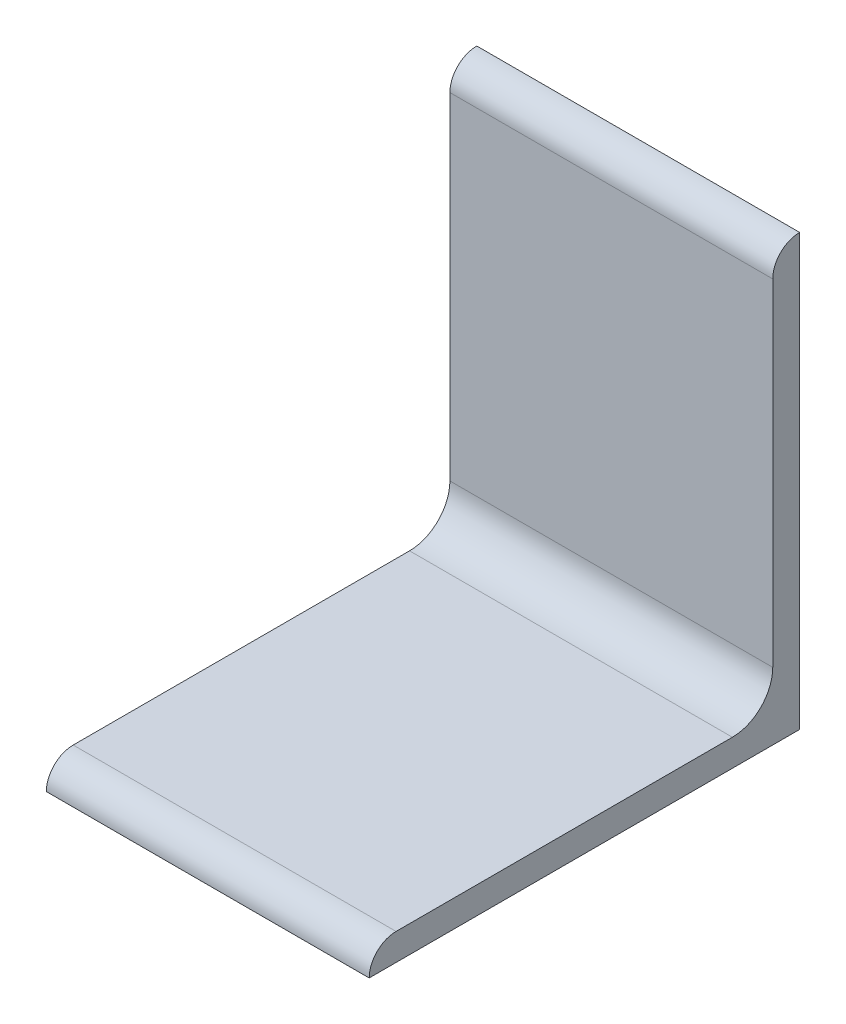
ISO-10303-21;
HEADER;
FILE_DESCRIPTION(('STEP AP214'),'2;1');
FILE_NAME('part.step','',(''),(''),'','','');
FILE_SCHEMA(('AUTOMOTIVE_DESIGN { 1 0 10303 214 1 1 1 1 }'));
ENDSEC;
DATA;
#1=APPLICATION_CONTEXT('core data for automotive mechanical design processes');
#2=APPLICATION_PROTOCOL_DEFINITION('international standard','automotive_design',2000,#1);
#3=PRODUCT_CONTEXT('',#1,'mechanical');
#4=PRODUCT('Part','Part','',(#3));
#5=PRODUCT_RELATED_PRODUCT_CATEGORY('part','',(#4));
#6=PRODUCT_DEFINITION_FORMATION('','',#4);
#7=PRODUCT_DEFINITION_CONTEXT('part definition',#1,'design');
#8=PRODUCT_DEFINITION('design','',#6,#7);
#9=PRODUCT_DEFINITION_SHAPE('','',#8);
#10=(LENGTH_UNIT() NAMED_UNIT(*) SI_UNIT(.MILLI.,.METRE.));
#11=(NAMED_UNIT(*) PLANE_ANGLE_UNIT() SI_UNIT($,.RADIAN.));
#12=(NAMED_UNIT(*) SI_UNIT($,.STERADIAN.) SOLID_ANGLE_UNIT());
#13=UNCERTAINTY_MEASURE_WITH_UNIT(LENGTH_MEASURE(1.E-05),#10,'distance_accuracy_value','');
#14=(GEOMETRIC_REPRESENTATION_CONTEXT(3) GLOBAL_UNCERTAINTY_ASSIGNED_CONTEXT((#13)) GLOBAL_UNIT_ASSIGNED_CONTEXT((#10,
#11,#12)) REPRESENTATION_CONTEXT('',''));
#15=CARTESIAN_POINT('',(0.,0.,0.));
#16=DIRECTION('',(0.,0.,1.));
#17=DIRECTION('',(1.,0.,0.));
#18=AXIS2_PLACEMENT_3D('',#15,#16,#17);
#19=CARTESIAN_POINT('',(38.1,50.8,0.));
#20=DIRECTION('',(0.,0.,1.));
#21=DIRECTION('',(1.,0.,0.));
#22=AXIS2_PLACEMENT_3D('',#19,#20,#21);
#23=PLANE('',#22);
#24=DIRECTION('',(0.,1.,0.));
#25=VECTOR('',#24,1.);
#26=CARTESIAN_POINT('',(0.,50.8,0.));
#27=LINE('',#26,#25);
#28=CARTESIAN_POINT('',(0.,0.,0.));
#29=VERTEX_POINT('',#28);
#30=CARTESIAN_POINT('',(0.,50.8,0.));
#31=VERTEX_POINT('',#30);
#32=EDGE_CURVE('E168',#29,#31,#27,.T.);
#33=ORIENTED_EDGE('',*,*,#32,.T.);
#34=DIRECTION('',(-1.,0.,0.));
#35=VECTOR('',#34,1.);
#36=CARTESIAN_POINT('',(38.1,50.8,0.));
#37=LINE('',#36,#35);
#38=CARTESIAN_POINT('',(38.1,50.8,0.));
#39=VERTEX_POINT('',#38);
#40=EDGE_CURVE('E13',#39,#31,#37,.T.);
#41=ORIENTED_EDGE('',*,*,#40,.F.);
#42=DIRECTION('',(0.,1.,0.));
#43=VECTOR('',#42,1.);
#44=CARTESIAN_POINT('',(38.1,50.8,0.));
#45=LINE('',#44,#43);
#46=CARTESIAN_POINT('',(38.1,0.,0.));
#47=VERTEX_POINT('',#46);
#48=EDGE_CURVE('E184',#47,#39,#45,.T.);
#49=ORIENTED_EDGE('',*,*,#48,.F.);
#50=DIRECTION('',(-1.,0.,0.));
#51=VECTOR('',#50,1.);
#52=CARTESIAN_POINT('',(38.1,0.,0.));
#53=LINE('',#52,#51);
#54=EDGE_CURVE('E164',#47,#29,#53,.T.);
#55=ORIENTED_EDGE('',*,*,#54,.T.);
#56=EDGE_LOOP('',(#33,#41,#49,#55));
#57=FACE_BOUND('',#56,.T.);
#58=ADVANCED_FACE('F66',(#57),#23,.F.);
#59=CARTESIAN_POINT('',(38.1,50.8,0.00508));
#60=DIRECTION('',(0.,-1.,0.));
#61=DIRECTION('',(0.,0.,-1.));
#62=AXIS2_PLACEMENT_3D('',#59,#60,#61);
#63=PLANE('',#62);
#64=DIRECTION('',(0.,0.,1.));
#65=VECTOR('',#64,1.);
#66=CARTESIAN_POINT('',(0.,50.8,0.00508));
#67=LINE('',#66,#65);
#68=CARTESIAN_POINT('',(0.,50.8,0.00508000000000012));
#69=VERTEX_POINT('',#68);
#70=EDGE_CURVE('E171',#31,#69,#67,.T.);
#71=ORIENTED_EDGE('',*,*,#70,.T.);
#72=DIRECTION('',(-1.,0.,0.));
#73=VECTOR('',#72,1.);
#74=CARTESIAN_POINT('',(38.1,50.8,0.00508000000000012));
#75=LINE('',#74,#73);
#76=CARTESIAN_POINT('',(38.1,50.8,0.00508000000000012));
#77=VERTEX_POINT('',#76);
#78=EDGE_CURVE('E74',#77,#69,#75,.T.);
#79=ORIENTED_EDGE('',*,*,#78,.F.);
#80=DIRECTION('',(0.,0.,1.));
#81=VECTOR('',#80,1.);
#82=CARTESIAN_POINT('',(38.1,50.8,0.00508));
#83=LINE('',#82,#81);
#84=EDGE_CURVE('E128',#39,#77,#83,.T.);
#85=ORIENTED_EDGE('',*,*,#84,.F.);
#86=ORIENTED_EDGE('',*,*,#40,.T.);
#87=EDGE_LOOP('',(#71,#79,#85,#86));
#88=FACE_BOUND('',#87,.T.);
#89=ADVANCED_FACE('F227',(#88),#63,.F.);
#90=CARTESIAN_POINT('',(38.1,47.63008,0.00507999999999961));
#91=DIRECTION('',(-1.,0.,0.));
#92=DIRECTION('',(0.,0.,1.));
#93=AXIS2_PLACEMENT_3D('',#90,#91,#92);
#94=CYLINDRICAL_SURFACE('',#93,3.16992);
#95=CARTESIAN_POINT('',(0.,47.63008,0.00507999999999961));
#96=DIRECTION('',(1.,0.,0.));
#97=DIRECTION('',(0.,0.,-1.));
#98=AXIS2_PLACEMENT_3D('',#95,#96,#97);
#99=CIRCLE('',#98,3.16992);
#100=CARTESIAN_POINT('',(0.,47.63008,3.175));
#101=VERTEX_POINT('',#100);
#102=EDGE_CURVE('E173',#69,#101,#99,.T.);
#103=ORIENTED_EDGE('',*,*,#102,.T.);
#104=DIRECTION('',(-1.,0.,0.));
#105=VECTOR('',#104,1.);
#106=CARTESIAN_POINT('',(38.1,47.63008,3.175));
#107=LINE('',#106,#105);
#108=CARTESIAN_POINT('',(38.1,47.63008,3.175));
#109=VERTEX_POINT('',#108);
#110=EDGE_CURVE('E194',#109,#101,#107,.T.);
#111=ORIENTED_EDGE('',*,*,#110,.F.);
#112=CARTESIAN_POINT('',(38.1,47.63008,0.00507999999999961));
#113=DIRECTION('',(1.,0.,0.));
#114=DIRECTION('',(0.,0.,-1.));
#115=AXIS2_PLACEMENT_3D('',#112,#113,#114);
#116=CIRCLE('',#115,3.16992);
#117=EDGE_CURVE('E202',#77,#109,#116,.T.);
#118=ORIENTED_EDGE('',*,*,#117,.F.);
#119=ORIENTED_EDGE('',*,*,#78,.T.);
#120=EDGE_LOOP('',(#103,#111,#118,#119));
#121=FACE_BOUND('',#120,.T.);
#122=ADVANCED_FACE('F200',(#121),#94,.T.);
#123=CARTESIAN_POINT('',(38.1,7.93750000000001,3.17499999999999));
#124=DIRECTION('',(0.,0.,-1.));
#125=DIRECTION('',(0.,1.,0.));
#126=AXIS2_PLACEMENT_3D('',#123,#124,#125);
#127=PLANE('',#126);
#128=DIRECTION('',(0.,-1.,0.));
#129=VECTOR('',#128,1.);
#130=CARTESIAN_POINT('',(0.,7.93750000000001,3.17499999999999));
#131=LINE('',#130,#129);
#132=CARTESIAN_POINT('',(0.,7.93750000000001,3.17499999999999));
#133=VERTEX_POINT('',#132);
#134=EDGE_CURVE('E175',#101,#133,#131,.T.);
#135=ORIENTED_EDGE('',*,*,#134,.T.);
#136=DIRECTION('',(-1.,0.,0.));
#137=VECTOR('',#136,1.);
#138=CARTESIAN_POINT('',(38.1,7.93750000000001,3.17499999999999));
#139=LINE('',#138,#137);
#140=CARTESIAN_POINT('',(38.1,7.93750000000001,3.17499999999999));
#141=VERTEX_POINT('',#140);
#142=EDGE_CURVE('E191',#141,#133,#139,.T.);
#143=ORIENTED_EDGE('',*,*,#142,.F.);
#144=DIRECTION('',(0.,-1.,0.));
#145=VECTOR('',#144,1.);
#146=CARTESIAN_POINT('',(38.1,7.93750000000001,3.17499999999999));
#147=LINE('',#146,#145);
#148=EDGE_CURVE('E218',#109,#141,#147,.T.);
#149=ORIENTED_EDGE('',*,*,#148,.F.);
#150=ORIENTED_EDGE('',*,*,#110,.T.);
#151=EDGE_LOOP('',(#135,#143,#149,#150));
#152=FACE_BOUND('',#151,.T.);
#153=ADVANCED_FACE('F211',(#152),#127,.F.);
#154=CARTESIAN_POINT('',(38.1,7.93750000000001,7.93749999999999));
#155=DIRECTION('',(-1.,0.,0.));
#156=DIRECTION('',(0.,0.,1.));
#157=AXIS2_PLACEMENT_3D('',#154,#155,#156);
#158=CYLINDRICAL_SURFACE('',#157,4.7625);
#159=CARTESIAN_POINT('',(0.,7.93750000000001,7.93749999999999));
#160=DIRECTION('',(-1.,0.,0.));
#161=DIRECTION('',(0.,0.,1.));
#162=AXIS2_PLACEMENT_3D('',#159,#160,#161);
#163=CIRCLE('',#162,4.7625);
#164=CARTESIAN_POINT('',(0.,3.17500000000001,7.93749999999999));
#165=VERTEX_POINT('',#164);
#166=EDGE_CURVE('E177',#133,#165,#163,.T.);
#167=ORIENTED_EDGE('',*,*,#166,.T.);
#168=DIRECTION('',(-1.,0.,0.));
#169=VECTOR('',#168,1.);
#170=CARTESIAN_POINT('',(38.1,3.17500000000001,7.93749999999999));
#171=LINE('',#170,#169);
#172=CARTESIAN_POINT('',(38.1,3.17500000000001,7.93749999999999));
#173=VERTEX_POINT('',#172);
#174=EDGE_CURVE('E188',#173,#165,#171,.T.);
#175=ORIENTED_EDGE('',*,*,#174,.F.);
#176=CARTESIAN_POINT('',(38.1,7.93750000000001,7.93749999999999));
#177=DIRECTION('',(-1.,0.,0.));
#178=DIRECTION('',(0.,0.,1.));
#179=AXIS2_PLACEMENT_3D('',#176,#177,#178);
#180=CIRCLE('',#179,4.7625);
#181=EDGE_CURVE('E217',#141,#173,#180,.T.);
#182=ORIENTED_EDGE('',*,*,#181,.F.);
#183=ORIENTED_EDGE('',*,*,#142,.T.);
#184=EDGE_LOOP('',(#167,#175,#182,#183));
#185=FACE_BOUND('',#184,.T.);
#186=ADVANCED_FACE('F215',(#185),#158,.F.);
#187=CARTESIAN_POINT('',(38.1,3.175,47.63008));
#188=DIRECTION('',(0.,-1.,0.));
#189=DIRECTION('',(0.,0.,-1.));
#190=AXIS2_PLACEMENT_3D('',#187,#188,#189);
#191=PLANE('',#190);
#192=DIRECTION('',(0.,0.,1.));
#193=VECTOR('',#192,1.);
#194=CARTESIAN_POINT('',(0.,3.175,47.63008));
#195=LINE('',#194,#193);
#196=CARTESIAN_POINT('',(0.,3.175,47.63008));
#197=VERTEX_POINT('',#196);
#198=EDGE_CURVE('E179',#165,#197,#195,.T.);
#199=ORIENTED_EDGE('',*,*,#198,.T.);
#200=DIRECTION('',(-1.,0.,0.));
#201=VECTOR('',#200,1.);
#202=CARTESIAN_POINT('',(38.1,3.175,47.63008));
#203=LINE('',#202,#201);
#204=CARTESIAN_POINT('',(38.1,3.175,47.63008));
#205=VERTEX_POINT('',#204);
#206=EDGE_CURVE('E159',#205,#197,#203,.T.);
#207=ORIENTED_EDGE('',*,*,#206,.F.);
#208=DIRECTION('',(0.,0.,1.));
#209=VECTOR('',#208,1.);
#210=CARTESIAN_POINT('',(38.1,3.175,47.63008));
#211=LINE('',#210,#209);
#212=EDGE_CURVE('E150',#173,#205,#211,.T.);
#213=ORIENTED_EDGE('',*,*,#212,.F.);
#214=ORIENTED_EDGE('',*,*,#174,.T.);
#215=EDGE_LOOP('',(#199,#207,#213,#214));
#216=FACE_BOUND('',#215,.T.);
#217=ADVANCED_FACE('F239',(#216),#191,.F.);
#218=CARTESIAN_POINT('',(38.1,0.00508000000000019,47.63008));
#219=DIRECTION('',(-1.,0.,0.));
#220=DIRECTION('',(0.,0.,1.));
#221=AXIS2_PLACEMENT_3D('',#218,#219,#220);
#222=CYLINDRICAL_SURFACE('',#221,3.16992);
#223=CARTESIAN_POINT('',(0.,0.00508000000000019,47.63008));
#224=DIRECTION('',(1.,0.,0.));
#225=DIRECTION('',(0.,0.,1.));
#226=AXIS2_PLACEMENT_3D('',#223,#224,#225);
#227=CIRCLE('',#226,3.16992);
#228=CARTESIAN_POINT('',(0.,0.00508,50.8));
#229=VERTEX_POINT('',#228);
#230=EDGE_CURVE('E158',#197,#229,#227,.T.);
#231=ORIENTED_EDGE('',*,*,#230,.T.);
#232=DIRECTION('',(-1.,0.,0.));
#233=VECTOR('',#232,1.);
#234=CARTESIAN_POINT('',(38.1,0.00508,50.8));
#235=LINE('',#234,#233);
#236=CARTESIAN_POINT('',(38.1,0.00508,50.8));
#237=VERTEX_POINT('',#236);
#238=EDGE_CURVE('E155',#237,#229,#235,.T.);
#239=ORIENTED_EDGE('',*,*,#238,.F.);
#240=CARTESIAN_POINT('',(38.1,0.00508000000000019,47.63008));
#241=DIRECTION('',(1.,0.,0.));
#242=DIRECTION('',(0.,0.,1.));
#243=AXIS2_PLACEMENT_3D('',#240,#241,#242);
#244=CIRCLE('',#243,3.16992);
#245=EDGE_CURVE('E144',#205,#237,#244,.T.);
#246=ORIENTED_EDGE('',*,*,#245,.F.);
#247=ORIENTED_EDGE('',*,*,#206,.T.);
#248=EDGE_LOOP('',(#231,#239,#246,#247));
#249=FACE_BOUND('',#248,.T.);
#250=ADVANCED_FACE('F156',(#249),#222,.T.);
#251=CARTESIAN_POINT('',(38.1,0.,50.8));
#252=DIRECTION('',(0.,0.,-1.));
#253=DIRECTION('',(-1.,0.,0.));
#254=AXIS2_PLACEMENT_3D('',#251,#252,#253);
#255=PLANE('',#254);
#256=DIRECTION('',(0.,-1.,0.));
#257=VECTOR('',#256,1.);
#258=CARTESIAN_POINT('',(0.,0.,50.8));
#259=LINE('',#258,#257);
#260=CARTESIAN_POINT('',(0.,0.,50.8));
#261=VERTEX_POINT('',#260);
#262=EDGE_CURVE('E114',#229,#261,#259,.T.);
#263=ORIENTED_EDGE('',*,*,#262,.T.);
#264=DIRECTION('',(-1.,0.,0.));
#265=VECTOR('',#264,1.);
#266=CARTESIAN_POINT('',(38.1,0.,50.8));
#267=LINE('',#266,#265);
#268=CARTESIAN_POINT('',(38.1,0.,50.8));
#269=VERTEX_POINT('',#268);
#270=EDGE_CURVE('E160',#269,#261,#267,.T.);
#271=ORIENTED_EDGE('',*,*,#270,.F.);
#272=DIRECTION('',(0.,-1.,0.));
#273=VECTOR('',#272,1.);
#274=CARTESIAN_POINT('',(38.1,0.,50.8));
#275=LINE('',#274,#273);
#276=EDGE_CURVE('E148',#237,#269,#275,.T.);
#277=ORIENTED_EDGE('',*,*,#276,.F.);
#278=ORIENTED_EDGE('',*,*,#238,.T.);
#279=EDGE_LOOP('',(#263,#271,#277,#278));
#280=FACE_BOUND('',#279,.T.);
#281=ADVANCED_FACE('F162',(#280),#255,.F.);
#282=CARTESIAN_POINT('',(38.1,0.,0.));
#283=DIRECTION('',(0.,1.,0.));
#284=DIRECTION('',(0.,0.,1.));
#285=AXIS2_PLACEMENT_3D('',#282,#283,#284);
#286=PLANE('',#285);
#287=DIRECTION('',(0.,0.,-1.));
#288=VECTOR('',#287,1.);
#289=CARTESIAN_POINT('',(0.,0.,0.));
#290=LINE('',#289,#288);
#291=EDGE_CURVE('E120',#261,#29,#290,.T.);
#292=ORIENTED_EDGE('',*,*,#291,.T.);
#293=ORIENTED_EDGE('',*,*,#54,.F.);
#294=DIRECTION('',(0.,0.,-1.));
#295=VECTOR('',#294,1.);
#296=CARTESIAN_POINT('',(38.1,0.,0.));
#297=LINE('',#296,#295);
#298=EDGE_CURVE('E82',#269,#47,#297,.T.);
#299=ORIENTED_EDGE('',*,*,#298,.F.);
#300=ORIENTED_EDGE('',*,*,#270,.T.);
#301=EDGE_LOOP('',(#292,#293,#299,#300));
#302=FACE_BOUND('',#301,.T.);
#303=ADVANCED_FACE('F247',(#302),#286,.F.);
#304=CARTESIAN_POINT('',(38.1,0.00508000000000019,47.63008));
#305=DIRECTION('',(-1.,0.,0.));
#306=DIRECTION('',(0.,0.,1.));
#307=AXIS2_PLACEMENT_3D('',#304,#305,#306);
#308=PLANE('',#307);
#309=ORIENTED_EDGE('',*,*,#48,.T.);
#310=ORIENTED_EDGE('',*,*,#84,.T.);
#311=ORIENTED_EDGE('',*,*,#117,.T.);
#312=ORIENTED_EDGE('',*,*,#148,.T.);
#313=ORIENTED_EDGE('',*,*,#181,.T.);
#314=ORIENTED_EDGE('',*,*,#212,.T.);
#315=ORIENTED_EDGE('',*,*,#245,.T.);
#316=ORIENTED_EDGE('',*,*,#276,.T.);
#317=ORIENTED_EDGE('',*,*,#298,.T.);
#318=EDGE_LOOP('',(#309,#310,#311,#312,#313,#314,#315,#316,#317));
#319=FACE_BOUND('',#318,.T.);
#320=ADVANCED_FACE('F146',(#319),#308,.F.);
#321=CARTESIAN_POINT('',(0.,0.00508000000000019,47.63008));
#322=DIRECTION('',(-1.,0.,0.));
#323=DIRECTION('',(0.,0.,1.));
#324=AXIS2_PLACEMENT_3D('',#321,#322,#323);
#325=PLANE('',#324);
#326=ORIENTED_EDGE('',*,*,#32,.F.);
#327=ORIENTED_EDGE('',*,*,#291,.F.);
#328=ORIENTED_EDGE('',*,*,#262,.F.);
#329=ORIENTED_EDGE('',*,*,#230,.F.);
#330=ORIENTED_EDGE('',*,*,#198,.F.);
#331=ORIENTED_EDGE('',*,*,#166,.F.);
#332=ORIENTED_EDGE('',*,*,#134,.F.);
#333=ORIENTED_EDGE('',*,*,#102,.F.);
#334=ORIENTED_EDGE('',*,*,#70,.F.);
#335=EDGE_LOOP('',(#326,#327,#328,#329,#330,#331,#332,#333,#334));
#336=FACE_BOUND('',#335,.T.);
#337=ADVANCED_FACE('F206',(#336),#325,.T.);
#338=CLOSED_SHELL('',(#58,#89,#122,#153,#186,#217,#250,#281,#303,#320,#337));
#339=MANIFOLD_SOLID_BREP('B2',#338);
#340=ADVANCED_BREP_SHAPE_REPRESENTATION('',(#18,#339),#14);
#341=SHAPE_DEFINITION_REPRESENTATION(#9,#340);
ENDSEC;
END-ISO-10303-21;
